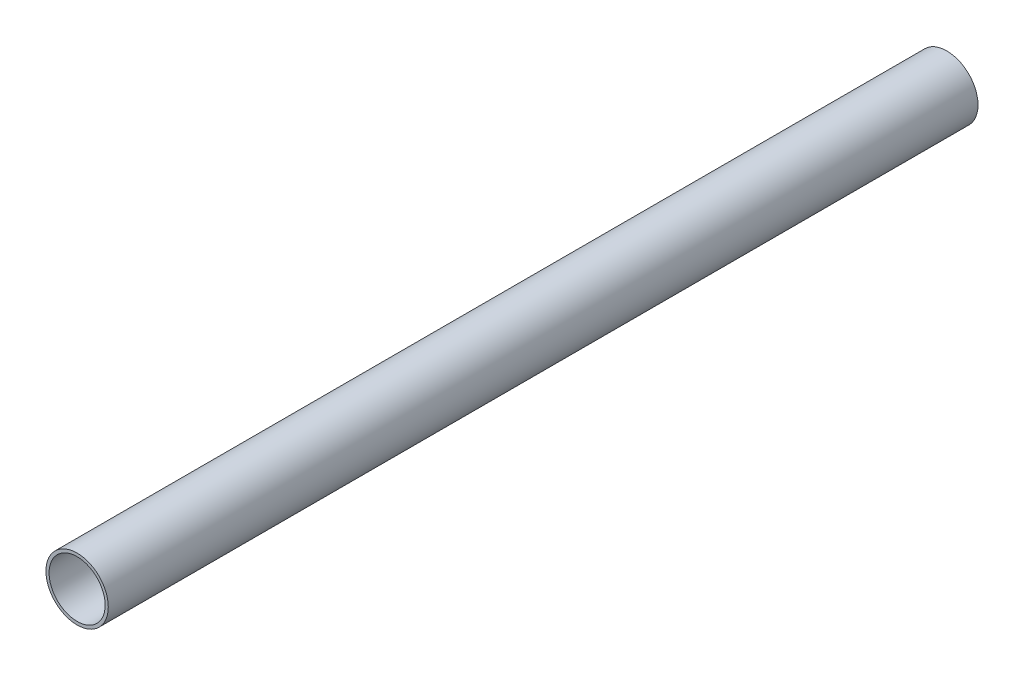
ISO-10303-21;
HEADER;
FILE_DESCRIPTION(('STEP AP214'),'2;1');
FILE_NAME('part.step','',(''),(''),'','','');
FILE_SCHEMA(('AUTOMOTIVE_DESIGN { 1 0 10303 214 1 1 1 1 }'));
ENDSEC;
DATA;
#1=APPLICATION_CONTEXT('core data for automotive mechanical design processes');
#2=APPLICATION_PROTOCOL_DEFINITION('international standard','automotive_design',2000,#1);
#3=PRODUCT_CONTEXT('',#1,'mechanical');
#4=PRODUCT('Part','Part','',(#3));
#5=PRODUCT_RELATED_PRODUCT_CATEGORY('part','',(#4));
#6=PRODUCT_DEFINITION_FORMATION('','',#4);
#7=PRODUCT_DEFINITION_CONTEXT('part definition',#1,'design');
#8=PRODUCT_DEFINITION('design','',#6,#7);
#9=PRODUCT_DEFINITION_SHAPE('','',#8);
#10=(LENGTH_UNIT() NAMED_UNIT(*) SI_UNIT(.MILLI.,.METRE.));
#11=(NAMED_UNIT(*) PLANE_ANGLE_UNIT() SI_UNIT($,.RADIAN.));
#12=(NAMED_UNIT(*) SI_UNIT($,.STERADIAN.) SOLID_ANGLE_UNIT());
#13=UNCERTAINTY_MEASURE_WITH_UNIT(LENGTH_MEASURE(1.E-05),#10,'distance_accuracy_value','');
#14=(GEOMETRIC_REPRESENTATION_CONTEXT(3) GLOBAL_UNCERTAINTY_ASSIGNED_CONTEXT((#13)) GLOBAL_UNIT_ASSIGNED_CONTEXT((#10,
#11,#12)) REPRESENTATION_CONTEXT('',''));
#15=CARTESIAN_POINT('',(0.,0.,0.));
#16=DIRECTION('',(0.,0.,1.));
#17=DIRECTION('',(1.,0.,0.));
#18=AXIS2_PLACEMENT_3D('',#15,#16,#17);
#19=CARTESIAN_POINT('',(0.,0.,279.));
#20=DIRECTION('',(0.,0.,1.));
#21=DIRECTION('',(1.,0.,0.));
#22=AXIS2_PLACEMENT_3D('',#19,#20,#21);
#23=PLANE('',#22);
#24=CARTESIAN_POINT('',(0.,0.,279.));
#25=DIRECTION('',(0.,0.,1.));
#26=DIRECTION('',(1.,0.,0.));
#27=AXIS2_PLACEMENT_3D('',#24,#25,#26);
#28=CIRCLE('',#27,10.);
#29=CARTESIAN_POINT('',(10.,0.,279.));
#30=VERTEX_POINT('',#29);
#31=EDGE_CURVE('E10',#30,#30,#28,.T.);
#32=ORIENTED_EDGE('',*,*,#31,.T.);
#33=EDGE_LOOP('',(#32));
#34=FACE_BOUND('',#33,.T.);
#35=CARTESIAN_POINT('',(0.,0.,279.));
#36=DIRECTION('',(0.,0.,1.));
#37=DIRECTION('',(1.,0.,0.));
#38=AXIS2_PLACEMENT_3D('',#35,#36,#37);
#39=CIRCLE('',#38,9.);
#40=CARTESIAN_POINT('',(9.,0.,279.));
#41=VERTEX_POINT('',#40);
#42=EDGE_CURVE('E50',#41,#41,#39,.T.);
#43=ORIENTED_EDGE('',*,*,#42,.F.);
#44=EDGE_LOOP('',(#43));
#45=FACE_BOUND('',#44,.T.);
#46=ADVANCED_FACE('F37',(#34,#45),#23,.T.);
#47=CARTESIAN_POINT('',(0.,0.,0.));
#48=DIRECTION('',(0.,0.,1.));
#49=DIRECTION('',(1.,0.,0.));
#50=AXIS2_PLACEMENT_3D('',#47,#48,#49);
#51=PLANE('',#50);
#52=CARTESIAN_POINT('',(0.,0.,0.));
#53=DIRECTION('',(0.,0.,1.));
#54=DIRECTION('',(1.,0.,0.));
#55=AXIS2_PLACEMENT_3D('',#52,#53,#54);
#56=CIRCLE('',#55,10.);
#57=CARTESIAN_POINT('',(10.,0.,0.));
#58=VERTEX_POINT('',#57);
#59=EDGE_CURVE('E41',#58,#58,#56,.T.);
#60=ORIENTED_EDGE('',*,*,#59,.F.);
#61=EDGE_LOOP('',(#60));
#62=FACE_BOUND('',#61,.T.);
#63=CARTESIAN_POINT('',(0.,0.,0.));
#64=DIRECTION('',(0.,0.,1.));
#65=DIRECTION('',(1.,0.,0.));
#66=AXIS2_PLACEMENT_3D('',#63,#64,#65);
#67=CIRCLE('',#66,9.);
#68=CARTESIAN_POINT('',(9.,0.,0.));
#69=VERTEX_POINT('',#68);
#70=EDGE_CURVE('E52',#69,#69,#67,.T.);
#71=ORIENTED_EDGE('',*,*,#70,.T.);
#72=EDGE_LOOP('',(#71));
#73=FACE_BOUND('',#72,.T.);
#74=ADVANCED_FACE('F64',(#62,#73),#51,.F.);
#75=CARTESIAN_POINT('',(0.,0.,279.));
#76=DIRECTION('',(0.,0.,-1.));
#77=DIRECTION('',(-1.,0.,0.));
#78=AXIS2_PLACEMENT_3D('',#75,#76,#77);
#79=CYLINDRICAL_SURFACE('',#78,10.);
#80=ORIENTED_EDGE('',*,*,#31,.F.);
#81=EDGE_LOOP('',(#80));
#82=FACE_BOUND('',#81,.T.);
#83=ORIENTED_EDGE('',*,*,#59,.T.);
#84=EDGE_LOOP('',(#83));
#85=FACE_BOUND('',#84,.T.);
#86=ADVANCED_FACE('F39',(#82,#85),#79,.T.);
#87=CARTESIAN_POINT('',(0.,0.,279.));
#88=DIRECTION('',(0.,0.,-1.));
#89=DIRECTION('',(-1.,0.,0.));
#90=AXIS2_PLACEMENT_3D('',#87,#88,#89);
#91=CYLINDRICAL_SURFACE('',#90,9.);
#92=ORIENTED_EDGE('',*,*,#42,.T.);
#93=EDGE_LOOP('',(#92));
#94=FACE_BOUND('',#93,.T.);
#95=ORIENTED_EDGE('',*,*,#70,.F.);
#96=EDGE_LOOP('',(#95));
#97=FACE_BOUND('',#96,.T.);
#98=ADVANCED_FACE('F60',(#94,#97),#91,.F.);
#99=CLOSED_SHELL('',(#46,#74,#86,#98));
#100=MANIFOLD_SOLID_BREP('B2',#99);
#101=ADVANCED_BREP_SHAPE_REPRESENTATION('',(#18,#100),#14);
#102=SHAPE_DEFINITION_REPRESENTATION(#9,#101);
ENDSEC;
END-ISO-10303-21;
